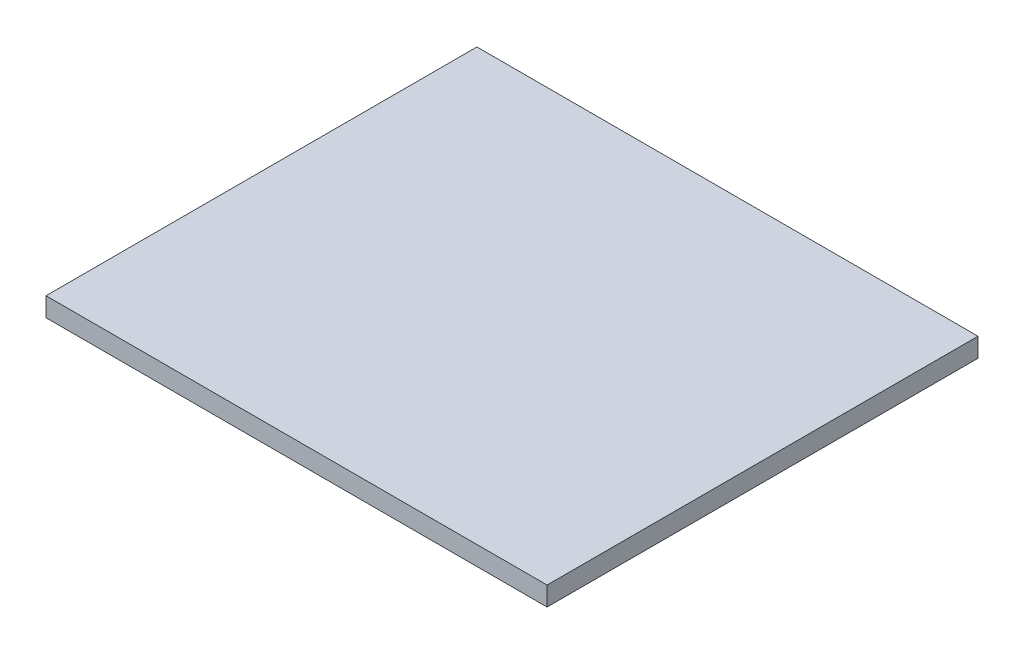
ISO-10303-21;
HEADER;
FILE_DESCRIPTION(('STEP AP214'),'2;1');
FILE_NAME('part.step','',(''),(''),'','','');
FILE_SCHEMA(('AUTOMOTIVE_DESIGN { 1 0 10303 214 1 1 1 1 }'));
ENDSEC;
DATA;
#1=APPLICATION_CONTEXT('core data for automotive mechanical design processes');
#2=APPLICATION_PROTOCOL_DEFINITION('international standard','automotive_design',2000,#1);
#3=PRODUCT_CONTEXT('',#1,'mechanical');
#4=PRODUCT('Part','Part','',(#3));
#5=PRODUCT_RELATED_PRODUCT_CATEGORY('part','',(#4));
#6=PRODUCT_DEFINITION_FORMATION('','',#4);
#7=PRODUCT_DEFINITION_CONTEXT('part definition',#1,'design');
#8=PRODUCT_DEFINITION('design','',#6,#7);
#9=PRODUCT_DEFINITION_SHAPE('','',#8);
#10=(LENGTH_UNIT() NAMED_UNIT(*) SI_UNIT(.MILLI.,.METRE.));
#11=(NAMED_UNIT(*) PLANE_ANGLE_UNIT() SI_UNIT($,.RADIAN.));
#12=(NAMED_UNIT(*) SI_UNIT($,.STERADIAN.) SOLID_ANGLE_UNIT());
#13=UNCERTAINTY_MEASURE_WITH_UNIT(LENGTH_MEASURE(1.E-05),#10,'distance_accuracy_value','');
#14=(GEOMETRIC_REPRESENTATION_CONTEXT(3) GLOBAL_UNCERTAINTY_ASSIGNED_CONTEXT((#13)) GLOBAL_UNIT_ASSIGNED_CONTEXT((#10,
#11,#12)) REPRESENTATION_CONTEXT('',''));
#15=CARTESIAN_POINT('',(0.,0.,0.));
#16=DIRECTION('',(0.,0.,1.));
#17=DIRECTION('',(1.,0.,0.));
#18=AXIS2_PLACEMENT_3D('',#15,#16,#17);
#19=CARTESIAN_POINT('',(250.,19.05,215.));
#20=DIRECTION('',(-1.,0.,0.));
#21=DIRECTION('',(0.,0.,1.));
#22=AXIS2_PLACEMENT_3D('',#19,#20,#21);
#23=PLANE('',#22);
#24=DIRECTION('',(0.,0.,-1.));
#25=VECTOR('',#24,1.);
#26=CARTESIAN_POINT('',(250.,0.,215.));
#27=LINE('',#26,#25);
#28=CARTESIAN_POINT('',(250.,0.,215.));
#29=VERTEX_POINT('',#28);
#30=CARTESIAN_POINT('',(250.,0.,-215.));
#31=VERTEX_POINT('',#30);
#32=EDGE_CURVE('E102',#29,#31,#27,.T.);
#33=ORIENTED_EDGE('',*,*,#32,.T.);
#34=DIRECTION('',(0.,-1.,0.));
#35=VECTOR('',#34,1.);
#36=CARTESIAN_POINT('',(250.,19.05,-215.));
#37=LINE('',#36,#35);
#38=CARTESIAN_POINT('',(250.,19.05,-215.));
#39=VERTEX_POINT('',#38);
#40=EDGE_CURVE('E11',#39,#31,#37,.T.);
#41=ORIENTED_EDGE('',*,*,#40,.F.);
#42=DIRECTION('',(0.,0.,-1.));
#43=VECTOR('',#42,1.);
#44=CARTESIAN_POINT('',(250.,19.05,215.));
#45=LINE('',#44,#43);
#46=CARTESIAN_POINT('',(250.,19.05,215.));
#47=VERTEX_POINT('',#46);
#48=EDGE_CURVE('E90',#47,#39,#45,.T.);
#49=ORIENTED_EDGE('',*,*,#48,.F.);
#50=DIRECTION('',(0.,-1.,0.));
#51=VECTOR('',#50,1.);
#52=CARTESIAN_POINT('',(250.,19.05,215.));
#53=LINE('',#52,#51);
#54=EDGE_CURVE('E98',#47,#29,#53,.T.);
#55=ORIENTED_EDGE('',*,*,#54,.T.);
#56=EDGE_LOOP('',(#33,#41,#49,#55));
#57=FACE_BOUND('',#56,.T.);
#58=ADVANCED_FACE('F39',(#57),#23,.F.);
#59=CARTESIAN_POINT('',(-250.,19.05,-215.));
#60=DIRECTION('',(0.,0.,1.));
#61=DIRECTION('',(1.,0.,0.));
#62=AXIS2_PLACEMENT_3D('',#59,#60,#61);
#63=PLANE('',#62);
#64=DIRECTION('',(-1.,0.,0.));
#65=VECTOR('',#64,1.);
#66=CARTESIAN_POINT('',(-250.,0.,-215.));
#67=LINE('',#66,#65);
#68=CARTESIAN_POINT('',(-250.,0.,-215.));
#69=VERTEX_POINT('',#68);
#70=EDGE_CURVE('E94',#31,#69,#67,.T.);
#71=ORIENTED_EDGE('',*,*,#70,.T.);
#72=DIRECTION('',(0.,-1.,0.));
#73=VECTOR('',#72,1.);
#74=CARTESIAN_POINT('',(-250.,19.05,-215.));
#75=LINE('',#74,#73);
#76=CARTESIAN_POINT('',(-250.,19.05,-215.));
#77=VERTEX_POINT('',#76);
#78=EDGE_CURVE('E47',#77,#69,#75,.T.);
#79=ORIENTED_EDGE('',*,*,#78,.F.);
#80=DIRECTION('',(-1.,0.,0.));
#81=VECTOR('',#80,1.);
#82=CARTESIAN_POINT('',(-250.,19.05,-215.));
#83=LINE('',#82,#81);
#84=EDGE_CURVE('E85',#39,#77,#83,.T.);
#85=ORIENTED_EDGE('',*,*,#84,.F.);
#86=ORIENTED_EDGE('',*,*,#40,.T.);
#87=EDGE_LOOP('',(#71,#79,#85,#86));
#88=FACE_BOUND('',#87,.T.);
#89=ADVANCED_FACE('F93',(#88),#63,.F.);
#90=CARTESIAN_POINT('',(-250.,19.05,215.));
#91=DIRECTION('',(1.,0.,0.));
#92=DIRECTION('',(0.,0.,-1.));
#93=AXIS2_PLACEMENT_3D('',#90,#91,#92);
#94=PLANE('',#93);
#95=DIRECTION('',(0.,0.,1.));
#96=VECTOR('',#95,1.);
#97=CARTESIAN_POINT('',(-250.,0.,215.));
#98=LINE('',#97,#96);
#99=CARTESIAN_POINT('',(-250.,0.,215.));
#100=VERTEX_POINT('',#99);
#101=EDGE_CURVE('E72',#69,#100,#98,.T.);
#102=ORIENTED_EDGE('',*,*,#101,.T.);
#103=DIRECTION('',(0.,-1.,0.));
#104=VECTOR('',#103,1.);
#105=CARTESIAN_POINT('',(-250.,19.05,215.));
#106=LINE('',#105,#104);
#107=CARTESIAN_POINT('',(-250.,19.05,215.));
#108=VERTEX_POINT('',#107);
#109=EDGE_CURVE('E95',#108,#100,#106,.T.);
#110=ORIENTED_EDGE('',*,*,#109,.F.);
#111=DIRECTION('',(0.,0.,1.));
#112=VECTOR('',#111,1.);
#113=CARTESIAN_POINT('',(-250.,19.05,215.));
#114=LINE('',#113,#112);
#115=EDGE_CURVE('E88',#77,#108,#114,.T.);
#116=ORIENTED_EDGE('',*,*,#115,.F.);
#117=ORIENTED_EDGE('',*,*,#78,.T.);
#118=EDGE_LOOP('',(#102,#110,#116,#117));
#119=FACE_BOUND('',#118,.T.);
#120=ADVANCED_FACE('F96',(#119),#94,.F.);
#121=CARTESIAN_POINT('',(-250.,19.05,215.));
#122=DIRECTION('',(0.,0.,-1.));
#123=DIRECTION('',(-1.,0.,0.));
#124=AXIS2_PLACEMENT_3D('',#121,#122,#123);
#125=PLANE('',#124);
#126=DIRECTION('',(1.,0.,0.));
#127=VECTOR('',#126,1.);
#128=CARTESIAN_POINT('',(-250.,0.,215.));
#129=LINE('',#128,#127);
#130=EDGE_CURVE('E78',#100,#29,#129,.T.);
#131=ORIENTED_EDGE('',*,*,#130,.T.);
#132=ORIENTED_EDGE('',*,*,#54,.F.);
#133=DIRECTION('',(1.,0.,0.));
#134=VECTOR('',#133,1.);
#135=CARTESIAN_POINT('',(-250.,19.05,215.));
#136=LINE('',#135,#134);
#137=EDGE_CURVE('E55',#108,#47,#136,.T.);
#138=ORIENTED_EDGE('',*,*,#137,.F.);
#139=ORIENTED_EDGE('',*,*,#109,.T.);
#140=EDGE_LOOP('',(#131,#132,#138,#139));
#141=FACE_BOUND('',#140,.T.);
#142=ADVANCED_FACE('F109',(#141),#125,.F.);
#143=CARTESIAN_POINT('',(0.,19.05,0.));
#144=DIRECTION('',(0.,-1.,0.));
#145=DIRECTION('',(0.,0.,-1.));
#146=AXIS2_PLACEMENT_3D('',#143,#144,#145);
#147=PLANE('',#146);
#148=ORIENTED_EDGE('',*,*,#48,.T.);
#149=ORIENTED_EDGE('',*,*,#84,.T.);
#150=ORIENTED_EDGE('',*,*,#115,.T.);
#151=ORIENTED_EDGE('',*,*,#137,.T.);
#152=EDGE_LOOP('',(#148,#149,#150,#151));
#153=FACE_BOUND('',#152,.T.);
#154=ADVANCED_FACE('F86',(#153),#147,.F.);
#155=CARTESIAN_POINT('',(0.,0.,0.));
#156=DIRECTION('',(0.,-1.,0.));
#157=DIRECTION('',(0.,0.,-1.));
#158=AXIS2_PLACEMENT_3D('',#155,#156,#157);
#159=PLANE('',#158);
#160=ORIENTED_EDGE('',*,*,#32,.F.);
#161=ORIENTED_EDGE('',*,*,#130,.F.);
#162=ORIENTED_EDGE('',*,*,#101,.F.);
#163=ORIENTED_EDGE('',*,*,#70,.F.);
#164=EDGE_LOOP('',(#160,#161,#162,#163));
#165=FACE_BOUND('',#164,.T.);
#166=ADVANCED_FACE('F112',(#165),#159,.T.);
#167=CLOSED_SHELL('',(#58,#89,#120,#142,#154,#166));
#168=MANIFOLD_SOLID_BREP('B2',#167);
#169=ADVANCED_BREP_SHAPE_REPRESENTATION('',(#18,#168),#14);
#170=SHAPE_DEFINITION_REPRESENTATION(#9,#169);
ENDSEC;
END-ISO-10303-21;
